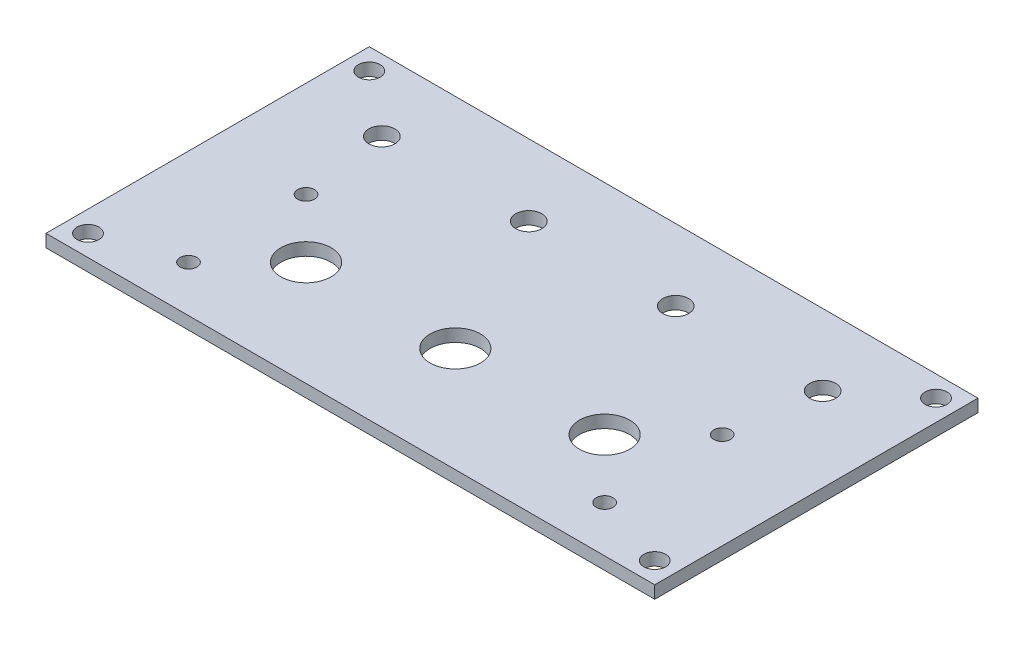
ISO-10303-21;
HEADER;
FILE_DESCRIPTION(('STEP AP214'),'2;1');
FILE_NAME('part.step','',(''),(''),'','','');
FILE_SCHEMA(('AUTOMOTIVE_DESIGN { 1 0 10303 214 1 1 1 1 }'));
ENDSEC;
DATA;
#1=APPLICATION_CONTEXT('core data for automotive mechanical design processes');
#2=APPLICATION_PROTOCOL_DEFINITION('international standard','automotive_design',2000,#1);
#3=PRODUCT_CONTEXT('',#1,'mechanical');
#4=PRODUCT('Part','Part','',(#3));
#5=PRODUCT_RELATED_PRODUCT_CATEGORY('part','',(#4));
#6=PRODUCT_DEFINITION_FORMATION('','',#4);
#7=PRODUCT_DEFINITION_CONTEXT('part definition',#1,'design');
#8=PRODUCT_DEFINITION('design','',#6,#7);
#9=PRODUCT_DEFINITION_SHAPE('','',#8);
#10=(LENGTH_UNIT() NAMED_UNIT(*) SI_UNIT(.MILLI.,.METRE.));
#11=(NAMED_UNIT(*) PLANE_ANGLE_UNIT() SI_UNIT($,.RADIAN.));
#12=(NAMED_UNIT(*) SI_UNIT($,.STERADIAN.) SOLID_ANGLE_UNIT());
#13=UNCERTAINTY_MEASURE_WITH_UNIT(LENGTH_MEASURE(1.E-05),#10,'distance_accuracy_value','');
#14=(GEOMETRIC_REPRESENTATION_CONTEXT(3) GLOBAL_UNCERTAINTY_ASSIGNED_CONTEXT((#13)) GLOBAL_UNIT_ASSIGNED_CONTEXT((#10,
#11,#12)) REPRESENTATION_CONTEXT('',''));
#15=CARTESIAN_POINT('',(0.,0.,0.));
#16=DIRECTION('',(0.,0.,1.));
#17=DIRECTION('',(1.,0.,0.));
#18=AXIS2_PLACEMENT_3D('',#15,#16,#17);
#19=CARTESIAN_POINT('',(0.,3.,0.));
#20=DIRECTION('',(0.,0.,-1.));
#21=DIRECTION('',(-1.,0.,0.));
#22=AXIS2_PLACEMENT_3D('',#19,#20,#21);
#23=PLANE('',#22);
#24=DIRECTION('',(1.,0.,0.));
#25=VECTOR('',#24,1.);
#26=CARTESIAN_POINT('',(0.,0.,0.));
#27=LINE('',#26,#25);
#28=CARTESIAN_POINT('',(0.,0.,0.));
#29=VERTEX_POINT('',#28);
#30=CARTESIAN_POINT('',(145.,0.,0.));
#31=VERTEX_POINT('',#30);
#32=EDGE_CURVE('E145',#29,#31,#27,.T.);
#33=ORIENTED_EDGE('',*,*,#32,.T.);
#34=DIRECTION('',(0.,-1.,0.));
#35=VECTOR('',#34,1.);
#36=CARTESIAN_POINT('',(145.,3.,0.));
#37=LINE('',#36,#35);
#38=CARTESIAN_POINT('',(145.,3.,0.));
#39=VERTEX_POINT('',#38);
#40=EDGE_CURVE('E11',#39,#31,#37,.T.);
#41=ORIENTED_EDGE('',*,*,#40,.F.);
#42=DIRECTION('',(1.,0.,0.));
#43=VECTOR('',#42,1.);
#44=CARTESIAN_POINT('',(0.,3.,0.));
#45=LINE('',#44,#43);
#46=CARTESIAN_POINT('',(0.,3.,0.));
#47=VERTEX_POINT('',#46);
#48=EDGE_CURVE('E86',#47,#39,#45,.T.);
#49=ORIENTED_EDGE('',*,*,#48,.F.);
#50=DIRECTION('',(0.,-1.,0.));
#51=VECTOR('',#50,1.);
#52=CARTESIAN_POINT('',(0.,3.,0.));
#53=LINE('',#52,#51);
#54=EDGE_CURVE('E52',#47,#29,#53,.T.);
#55=ORIENTED_EDGE('',*,*,#54,.T.);
#56=EDGE_LOOP('',(#33,#41,#49,#55));
#57=FACE_BOUND('',#56,.T.);
#58=ADVANCED_FACE('F35',(#57),#23,.F.);
#59=CARTESIAN_POINT('',(145.,3.,0.));
#60=DIRECTION('',(-1.,0.,0.));
#61=DIRECTION('',(0.,0.,1.));
#62=AXIS2_PLACEMENT_3D('',#59,#60,#61);
#63=PLANE('',#62);
#64=DIRECTION('',(0.,0.,-1.));
#65=VECTOR('',#64,1.);
#66=CARTESIAN_POINT('',(145.,0.,0.));
#67=LINE('',#66,#65);
#68=CARTESIAN_POINT('',(145.,0.,-77.));
#69=VERTEX_POINT('',#68);
#70=EDGE_CURVE('E91',#31,#69,#67,.T.);
#71=ORIENTED_EDGE('',*,*,#70,.T.);
#72=DIRECTION('',(0.,-1.,0.));
#73=VECTOR('',#72,1.);
#74=CARTESIAN_POINT('',(145.,3.,-77.));
#75=LINE('',#74,#73);
#76=CARTESIAN_POINT('',(145.,3.,-77.));
#77=VERTEX_POINT('',#76);
#78=EDGE_CURVE('E44',#77,#69,#75,.T.);
#79=ORIENTED_EDGE('',*,*,#78,.F.);
#80=DIRECTION('',(0.,0.,-1.));
#81=VECTOR('',#80,1.);
#82=CARTESIAN_POINT('',(145.,3.,0.));
#83=LINE('',#82,#81);
#84=EDGE_CURVE('E77',#39,#77,#83,.T.);
#85=ORIENTED_EDGE('',*,*,#84,.F.);
#86=ORIENTED_EDGE('',*,*,#40,.T.);
#87=EDGE_LOOP('',(#71,#79,#85,#86));
#88=FACE_BOUND('',#87,.T.);
#89=ADVANCED_FACE('F90',(#88),#63,.F.);
#90=CARTESIAN_POINT('',(0.,3.,-77.));
#91=DIRECTION('',(0.,0.,-1.));
#92=DIRECTION('',(-1.,0.,0.));
#93=AXIS2_PLACEMENT_3D('',#90,#91,#92);
#94=PLANE('',#93);
#95=DIRECTION('',(1.,0.,0.));
#96=VECTOR('',#95,1.);
#97=CARTESIAN_POINT('',(0.,0.,-77.));
#98=LINE('',#97,#96);
#99=CARTESIAN_POINT('',(0.,0.,-77.));
#100=VERTEX_POINT('',#99);
#101=EDGE_CURVE('E148',#100,#69,#98,.T.);
#102=ORIENTED_EDGE('',*,*,#101,.F.);
#103=DIRECTION('',(0.,-1.,0.));
#104=VECTOR('',#103,1.);
#105=CARTESIAN_POINT('',(0.,3.,-77.));
#106=LINE('',#105,#104);
#107=CARTESIAN_POINT('',(0.,3.,-77.));
#108=VERTEX_POINT('',#107);
#109=EDGE_CURVE('E66',#108,#100,#106,.T.);
#110=ORIENTED_EDGE('',*,*,#109,.F.);
#111=DIRECTION('',(1.,0.,0.));
#112=VECTOR('',#111,1.);
#113=CARTESIAN_POINT('',(0.,3.,-77.));
#114=LINE('',#113,#112);
#115=EDGE_CURVE('E85',#108,#77,#114,.T.);
#116=ORIENTED_EDGE('',*,*,#115,.T.);
#117=ORIENTED_EDGE('',*,*,#78,.T.);
#118=EDGE_LOOP('',(#102,#110,#116,#117));
#119=FACE_BOUND('',#118,.T.);
#120=ADVANCED_FACE('F94',(#119),#94,.T.);
#121=CARTESIAN_POINT('',(90.,3.,-60.));
#122=DIRECTION('',(0.,-1.,0.));
#123=DIRECTION('',(0.,0.,-1.));
#124=AXIS2_PLACEMENT_3D('',#121,#122,#123);
#125=CYLINDRICAL_SURFACE('',#124,3.1);
#126=CARTESIAN_POINT('',(90.,3.,-60.));
#127=DIRECTION('',(0.,1.,0.));
#128=DIRECTION('',(0.,0.,1.));
#129=AXIS2_PLACEMENT_3D('',#126,#127,#128);
#130=CIRCLE('',#129,3.1);
#131=CARTESIAN_POINT('',(90.,3.,-56.9));
#132=VERTEX_POINT('',#131);
#133=EDGE_CURVE('E106',#132,#132,#130,.T.);
#134=ORIENTED_EDGE('',*,*,#133,.T.);
#135=EDGE_LOOP('',(#134));
#136=FACE_BOUND('',#135,.T.);
#137=CARTESIAN_POINT('',(90.,0.,-60.));
#138=DIRECTION('',(0.,1.,0.));
#139=DIRECTION('',(0.,0.,1.));
#140=AXIS2_PLACEMENT_3D('',#137,#138,#139);
#141=CIRCLE('',#140,3.1);
#142=CARTESIAN_POINT('',(90.,0.,-56.9));
#143=VERTEX_POINT('',#142);
#144=EDGE_CURVE('E159',#143,#143,#141,.T.);
#145=ORIENTED_EDGE('',*,*,#144,.F.);
#146=EDGE_LOOP('',(#145));
#147=FACE_BOUND('',#146,.T.);
#148=ADVANCED_FACE('F300',(#136,#147),#125,.F.);
#149=CARTESIAN_POINT('',(55.,3.,-60.));
#150=DIRECTION('',(0.,-1.,0.));
#151=DIRECTION('',(0.,0.,-1.));
#152=AXIS2_PLACEMENT_3D('',#149,#150,#151);
#153=CYLINDRICAL_SURFACE('',#152,3.1);
#154=CARTESIAN_POINT('',(55.,3.,-60.));
#155=DIRECTION('',(0.,1.,0.));
#156=DIRECTION('',(0.,0.,1.));
#157=AXIS2_PLACEMENT_3D('',#154,#155,#156);
#158=CIRCLE('',#157,3.1);
#159=CARTESIAN_POINT('',(55.,3.,-56.9));
#160=VERTEX_POINT('',#159);
#161=EDGE_CURVE('E103',#160,#160,#158,.T.);
#162=ORIENTED_EDGE('',*,*,#161,.T.);
#163=EDGE_LOOP('',(#162));
#164=FACE_BOUND('',#163,.T.);
#165=CARTESIAN_POINT('',(55.,0.,-60.));
#166=DIRECTION('',(0.,1.,0.));
#167=DIRECTION('',(0.,0.,1.));
#168=AXIS2_PLACEMENT_3D('',#165,#166,#167);
#169=CIRCLE('',#168,3.1);
#170=CARTESIAN_POINT('',(55.,0.,-56.9));
#171=VERTEX_POINT('',#170);
#172=EDGE_CURVE('E156',#171,#171,#169,.T.);
#173=ORIENTED_EDGE('',*,*,#172,.F.);
#174=EDGE_LOOP('',(#173));
#175=FACE_BOUND('',#174,.T.);
#176=ADVANCED_FACE('F302',(#164,#175),#153,.F.);
#177=CARTESIAN_POINT('',(20.,3.,-60.));
#178=DIRECTION('',(0.,-1.,0.));
#179=DIRECTION('',(0.,0.,-1.));
#180=AXIS2_PLACEMENT_3D('',#177,#178,#179);
#181=CYLINDRICAL_SURFACE('',#180,3.1);
#182=CARTESIAN_POINT('',(20.,3.,-60.));
#183=DIRECTION('',(0.,1.,0.));
#184=DIRECTION('',(0.,0.,1.));
#185=AXIS2_PLACEMENT_3D('',#182,#183,#184);
#186=CIRCLE('',#185,3.1);
#187=CARTESIAN_POINT('',(20.,3.,-56.9));
#188=VERTEX_POINT('',#187);
#189=EDGE_CURVE('E97',#188,#188,#186,.T.);
#190=ORIENTED_EDGE('',*,*,#189,.T.);
#191=EDGE_LOOP('',(#190));
#192=FACE_BOUND('',#191,.T.);
#193=CARTESIAN_POINT('',(20.,0.,-60.));
#194=DIRECTION('',(0.,1.,0.));
#195=DIRECTION('',(0.,0.,1.));
#196=AXIS2_PLACEMENT_3D('',#193,#194,#195);
#197=CIRCLE('',#196,3.1);
#198=CARTESIAN_POINT('',(20.,0.,-56.9));
#199=VERTEX_POINT('',#198);
#200=EDGE_CURVE('E153',#199,#199,#197,.T.);
#201=ORIENTED_EDGE('',*,*,#200,.F.);
#202=EDGE_LOOP('',(#201));
#203=FACE_BOUND('',#202,.T.);
#204=ADVANCED_FACE('F309',(#192,#203),#181,.F.);
#205=CARTESIAN_POINT('',(0.,3.,0.));
#206=DIRECTION('',(-1.,0.,0.));
#207=DIRECTION('',(0.,0.,1.));
#208=AXIS2_PLACEMENT_3D('',#205,#206,#207);
#209=PLANE('',#208);
#210=DIRECTION('',(0.,0.,-1.));
#211=VECTOR('',#210,1.);
#212=CARTESIAN_POINT('',(0.,0.,0.));
#213=LINE('',#212,#211);
#214=EDGE_CURVE('E150',#29,#100,#213,.T.);
#215=ORIENTED_EDGE('',*,*,#214,.F.);
#216=ORIENTED_EDGE('',*,*,#54,.F.);
#217=DIRECTION('',(0.,0.,-1.));
#218=VECTOR('',#217,1.);
#219=CARTESIAN_POINT('',(0.,3.,0.));
#220=LINE('',#219,#218);
#221=EDGE_CURVE('E95',#47,#108,#220,.T.);
#222=ORIENTED_EDGE('',*,*,#221,.T.);
#223=ORIENTED_EDGE('',*,*,#109,.T.);
#224=EDGE_LOOP('',(#215,#216,#222,#223));
#225=FACE_BOUND('',#224,.T.);
#226=ADVANCED_FACE('F233',(#225),#209,.T.);
#227=CARTESIAN_POINT('',(5.,3.,-72.));
#228=DIRECTION('',(0.,-1.,0.));
#229=DIRECTION('',(0.,0.,-1.));
#230=AXIS2_PLACEMENT_3D('',#227,#228,#229);
#231=CYLINDRICAL_SURFACE('',#230,2.6);
#232=CARTESIAN_POINT('',(5.,3.,-72.));
#233=DIRECTION('',(0.,1.,0.));
#234=DIRECTION('',(0.,0.,1.));
#235=AXIS2_PLACEMENT_3D('',#232,#233,#234);
#236=CIRCLE('',#235,2.6);
#237=CARTESIAN_POINT('',(5.,3.,-69.4));
#238=VERTEX_POINT('',#237);
#239=EDGE_CURVE('E201',#238,#238,#236,.T.);
#240=ORIENTED_EDGE('',*,*,#239,.T.);
#241=EDGE_LOOP('',(#240));
#242=FACE_BOUND('',#241,.T.);
#243=CARTESIAN_POINT('',(5.,0.,-72.));
#244=DIRECTION('',(0.,1.,0.));
#245=DIRECTION('',(0.,0.,1.));
#246=AXIS2_PLACEMENT_3D('',#243,#244,#245);
#247=CIRCLE('',#246,2.6);
#248=CARTESIAN_POINT('',(5.,0.,-69.4));
#249=VERTEX_POINT('',#248);
#250=EDGE_CURVE('E142',#249,#249,#247,.T.);
#251=ORIENTED_EDGE('',*,*,#250,.F.);
#252=EDGE_LOOP('',(#251));
#253=FACE_BOUND('',#252,.T.);
#254=ADVANCED_FACE('F205',(#242,#253),#231,.F.);
#255=CARTESIAN_POINT('',(5.,3.,-5.));
#256=DIRECTION('',(0.,-1.,0.));
#257=DIRECTION('',(0.,0.,-1.));
#258=AXIS2_PLACEMENT_3D('',#255,#256,#257);
#259=CYLINDRICAL_SURFACE('',#258,2.6);
#260=CARTESIAN_POINT('',(5.,3.,-5.));
#261=DIRECTION('',(0.,1.,0.));
#262=DIRECTION('',(0.,0.,1.));
#263=AXIS2_PLACEMENT_3D('',#260,#261,#262);
#264=CIRCLE('',#263,2.6);
#265=CARTESIAN_POINT('',(5.,3.,-2.4));
#266=VERTEX_POINT('',#265);
#267=EDGE_CURVE('E198',#266,#266,#264,.T.);
#268=ORIENTED_EDGE('',*,*,#267,.T.);
#269=EDGE_LOOP('',(#268));
#270=FACE_BOUND('',#269,.T.);
#271=CARTESIAN_POINT('',(5.,0.,-5.));
#272=DIRECTION('',(0.,1.,0.));
#273=DIRECTION('',(0.,0.,1.));
#274=AXIS2_PLACEMENT_3D('',#271,#272,#273);
#275=CIRCLE('',#274,2.6);
#276=CARTESIAN_POINT('',(5.,0.,-2.4));
#277=VERTEX_POINT('',#276);
#278=EDGE_CURVE('E139',#277,#277,#275,.T.);
#279=ORIENTED_EDGE('',*,*,#278,.F.);
#280=EDGE_LOOP('',(#279));
#281=FACE_BOUND('',#280,.T.);
#282=ADVANCED_FACE('F232',(#270,#281),#259,.F.);
#283=CARTESIAN_POINT('',(140.,3.,-5.));
#284=DIRECTION('',(0.,-1.,0.));
#285=DIRECTION('',(0.,0.,-1.));
#286=AXIS2_PLACEMENT_3D('',#283,#284,#285);
#287=CYLINDRICAL_SURFACE('',#286,2.59999999999999);
#288=CARTESIAN_POINT('',(140.,3.,-5.));
#289=DIRECTION('',(0.,1.,0.));
#290=DIRECTION('',(0.,0.,1.));
#291=AXIS2_PLACEMENT_3D('',#288,#289,#290);
#292=CIRCLE('',#291,2.59999999999999);
#293=CARTESIAN_POINT('',(140.,3.,-2.40000000000001));
#294=VERTEX_POINT('',#293);
#295=EDGE_CURVE('E195',#294,#294,#292,.T.);
#296=ORIENTED_EDGE('',*,*,#295,.T.);
#297=EDGE_LOOP('',(#296));
#298=FACE_BOUND('',#297,.T.);
#299=CARTESIAN_POINT('',(140.,0.,-5.));
#300=DIRECTION('',(0.,1.,0.));
#301=DIRECTION('',(0.,0.,1.));
#302=AXIS2_PLACEMENT_3D('',#299,#300,#301);
#303=CIRCLE('',#302,2.59999999999999);
#304=CARTESIAN_POINT('',(140.,0.,-2.40000000000001));
#305=VERTEX_POINT('',#304);
#306=EDGE_CURVE('E136',#305,#305,#303,.T.);
#307=ORIENTED_EDGE('',*,*,#306,.F.);
#308=EDGE_LOOP('',(#307));
#309=FACE_BOUND('',#308,.T.);
#310=ADVANCED_FACE('F236',(#298,#309),#287,.F.);
#311=CARTESIAN_POINT('',(140.,3.,-72.));
#312=DIRECTION('',(0.,-1.,0.));
#313=DIRECTION('',(0.,0.,-1.));
#314=AXIS2_PLACEMENT_3D('',#311,#312,#313);
#315=CYLINDRICAL_SURFACE('',#314,2.59999999999999);
#316=CARTESIAN_POINT('',(140.,3.,-72.));
#317=DIRECTION('',(0.,1.,0.));
#318=DIRECTION('',(0.,0.,1.));
#319=AXIS2_PLACEMENT_3D('',#316,#317,#318);
#320=CIRCLE('',#319,2.59999999999999);
#321=CARTESIAN_POINT('',(140.,3.,-69.4));
#322=VERTEX_POINT('',#321);
#323=EDGE_CURVE('E192',#322,#322,#320,.T.);
#324=ORIENTED_EDGE('',*,*,#323,.T.);
#325=EDGE_LOOP('',(#324));
#326=FACE_BOUND('',#325,.T.);
#327=CARTESIAN_POINT('',(140.,0.,-72.));
#328=DIRECTION('',(0.,1.,0.));
#329=DIRECTION('',(0.,0.,1.));
#330=AXIS2_PLACEMENT_3D('',#327,#328,#329);
#331=CIRCLE('',#330,2.59999999999999);
#332=CARTESIAN_POINT('',(140.,0.,-69.4));
#333=VERTEX_POINT('',#332);
#334=EDGE_CURVE('E133',#333,#333,#331,.T.);
#335=ORIENTED_EDGE('',*,*,#334,.F.);
#336=EDGE_LOOP('',(#335));
#337=FACE_BOUND('',#336,.T.);
#338=ADVANCED_FACE('F240',(#326,#337),#315,.F.);
#339=CARTESIAN_POINT('',(36.94,3.,-25.));
#340=DIRECTION('',(0.,-1.,0.));
#341=DIRECTION('',(0.,0.,-1.));
#342=AXIS2_PLACEMENT_3D('',#339,#340,#341);
#343=CYLINDRICAL_SURFACE('',#342,6.);
#344=CARTESIAN_POINT('',(36.94,3.,-25.));
#345=DIRECTION('',(0.,1.,0.));
#346=DIRECTION('',(0.,0.,1.));
#347=AXIS2_PLACEMENT_3D('',#344,#345,#346);
#348=CIRCLE('',#347,6.);
#349=CARTESIAN_POINT('',(36.94,3.,-19.));
#350=VERTEX_POINT('',#349);
#351=EDGE_CURVE('E189',#350,#350,#348,.T.);
#352=ORIENTED_EDGE('',*,*,#351,.T.);
#353=EDGE_LOOP('',(#352));
#354=FACE_BOUND('',#353,.T.);
#355=CARTESIAN_POINT('',(36.94,0.,-25.));
#356=DIRECTION('',(0.,1.,0.));
#357=DIRECTION('',(0.,0.,1.));
#358=AXIS2_PLACEMENT_3D('',#355,#356,#357);
#359=CIRCLE('',#358,6.);
#360=CARTESIAN_POINT('',(36.94,0.,-19.));
#361=VERTEX_POINT('',#360);
#362=EDGE_CURVE('E130',#361,#361,#359,.T.);
#363=ORIENTED_EDGE('',*,*,#362,.F.);
#364=EDGE_LOOP('',(#363));
#365=FACE_BOUND('',#364,.T.);
#366=ADVANCED_FACE('F244',(#354,#365),#343,.F.);
#367=CARTESIAN_POINT('',(72.5,3.,-25.));
#368=DIRECTION('',(0.,-1.,0.));
#369=DIRECTION('',(0.,0.,-1.));
#370=AXIS2_PLACEMENT_3D('',#367,#368,#369);
#371=CYLINDRICAL_SURFACE('',#370,6.);
#372=CARTESIAN_POINT('',(72.5,3.,-25.));
#373=DIRECTION('',(0.,1.,0.));
#374=DIRECTION('',(0.,0.,1.));
#375=AXIS2_PLACEMENT_3D('',#372,#373,#374);
#376=CIRCLE('',#375,6.);
#377=CARTESIAN_POINT('',(72.5,3.,-19.));
#378=VERTEX_POINT('',#377);
#379=EDGE_CURVE('E186',#378,#378,#376,.T.);
#380=ORIENTED_EDGE('',*,*,#379,.T.);
#381=EDGE_LOOP('',(#380));
#382=FACE_BOUND('',#381,.T.);
#383=CARTESIAN_POINT('',(72.5,0.,-25.));
#384=DIRECTION('',(0.,1.,0.));
#385=DIRECTION('',(0.,0.,1.));
#386=AXIS2_PLACEMENT_3D('',#383,#384,#385);
#387=CIRCLE('',#386,6.);
#388=CARTESIAN_POINT('',(72.5,0.,-19.));
#389=VERTEX_POINT('',#388);
#390=EDGE_CURVE('E127',#389,#389,#387,.T.);
#391=ORIENTED_EDGE('',*,*,#390,.F.);
#392=EDGE_LOOP('',(#391));
#393=FACE_BOUND('',#392,.T.);
#394=ADVANCED_FACE('F248',(#382,#393),#371,.F.);
#395=CARTESIAN_POINT('',(108.06,3.,-25.));
#396=DIRECTION('',(0.,-1.,0.));
#397=DIRECTION('',(0.,0.,-1.));
#398=AXIS2_PLACEMENT_3D('',#395,#396,#397);
#399=CYLINDRICAL_SURFACE('',#398,6.00000000000002);
#400=CARTESIAN_POINT('',(108.06,3.,-25.));
#401=DIRECTION('',(0.,1.,0.));
#402=DIRECTION('',(0.,0.,1.));
#403=AXIS2_PLACEMENT_3D('',#400,#401,#402);
#404=CIRCLE('',#403,6.00000000000002);
#405=CARTESIAN_POINT('',(108.06,3.,-19.));
#406=VERTEX_POINT('',#405);
#407=EDGE_CURVE('E183',#406,#406,#404,.T.);
#408=ORIENTED_EDGE('',*,*,#407,.T.);
#409=EDGE_LOOP('',(#408));
#410=FACE_BOUND('',#409,.T.);
#411=CARTESIAN_POINT('',(108.06,0.,-25.));
#412=DIRECTION('',(0.,1.,0.));
#413=DIRECTION('',(0.,0.,1.));
#414=AXIS2_PLACEMENT_3D('',#411,#412,#413);
#415=CIRCLE('',#414,6.00000000000002);
#416=CARTESIAN_POINT('',(108.06,0.,-19.));
#417=VERTEX_POINT('',#416);
#418=EDGE_CURVE('E124',#417,#417,#415,.T.);
#419=ORIENTED_EDGE('',*,*,#418,.F.);
#420=EDGE_LOOP('',(#419));
#421=FACE_BOUND('',#420,.T.);
#422=ADVANCED_FACE('F252',(#410,#421),#399,.F.);
#423=CARTESIAN_POINT('',(22.94,3.,-39.));
#424=DIRECTION('',(0.,-1.,0.));
#425=DIRECTION('',(0.,0.,-1.));
#426=AXIS2_PLACEMENT_3D('',#423,#424,#425);
#427=CYLINDRICAL_SURFACE('',#426,2.);
#428=CARTESIAN_POINT('',(22.94,3.,-39.));
#429=DIRECTION('',(0.,1.,0.));
#430=DIRECTION('',(0.,0.,1.));
#431=AXIS2_PLACEMENT_3D('',#428,#429,#430);
#432=CIRCLE('',#431,2.);
#433=CARTESIAN_POINT('',(22.94,3.,-37.));
#434=VERTEX_POINT('',#433);
#435=EDGE_CURVE('E180',#434,#434,#432,.T.);
#436=ORIENTED_EDGE('',*,*,#435,.T.);
#437=EDGE_LOOP('',(#436));
#438=FACE_BOUND('',#437,.T.);
#439=CARTESIAN_POINT('',(22.94,0.,-39.));
#440=DIRECTION('',(0.,1.,0.));
#441=DIRECTION('',(0.,0.,1.));
#442=AXIS2_PLACEMENT_3D('',#439,#440,#441);
#443=CIRCLE('',#442,2.);
#444=CARTESIAN_POINT('',(22.94,0.,-37.));
#445=VERTEX_POINT('',#444);
#446=EDGE_CURVE('E121',#445,#445,#443,.T.);
#447=ORIENTED_EDGE('',*,*,#446,.F.);
#448=EDGE_LOOP('',(#447));
#449=FACE_BOUND('',#448,.T.);
#450=ADVANCED_FACE('F256',(#438,#449),#427,.F.);
#451=CARTESIAN_POINT('',(122.06,3.,-39.));
#452=DIRECTION('',(0.,-1.,0.));
#453=DIRECTION('',(0.,0.,-1.));
#454=AXIS2_PLACEMENT_3D('',#451,#452,#453);
#455=CYLINDRICAL_SURFACE('',#454,2.);
#456=CARTESIAN_POINT('',(122.06,3.,-39.));
#457=DIRECTION('',(0.,1.,0.));
#458=DIRECTION('',(0.,0.,1.));
#459=AXIS2_PLACEMENT_3D('',#456,#457,#458);
#460=CIRCLE('',#459,2.);
#461=CARTESIAN_POINT('',(122.06,3.,-37.));
#462=VERTEX_POINT('',#461);
#463=EDGE_CURVE('E175',#462,#462,#460,.T.);
#464=ORIENTED_EDGE('',*,*,#463,.T.);
#465=EDGE_LOOP('',(#464));
#466=FACE_BOUND('',#465,.T.);
#467=CARTESIAN_POINT('',(122.06,0.,-39.));
#468=DIRECTION('',(0.,1.,0.));
#469=DIRECTION('',(0.,0.,1.));
#470=AXIS2_PLACEMENT_3D('',#467,#468,#469);
#471=CIRCLE('',#470,2.);
#472=CARTESIAN_POINT('',(122.06,0.,-37.));
#473=VERTEX_POINT('',#472);
#474=EDGE_CURVE('E118',#473,#473,#471,.T.);
#475=ORIENTED_EDGE('',*,*,#474,.F.);
#476=EDGE_LOOP('',(#475));
#477=FACE_BOUND('',#476,.T.);
#478=ADVANCED_FACE('F260',(#466,#477),#455,.F.);
#479=CARTESIAN_POINT('',(122.06,3.,-11.));
#480=DIRECTION('',(0.,-1.,0.));
#481=DIRECTION('',(0.,0.,-1.));
#482=AXIS2_PLACEMENT_3D('',#479,#480,#481);
#483=CYLINDRICAL_SURFACE('',#482,2.);
#484=CARTESIAN_POINT('',(122.06,3.,-11.));
#485=DIRECTION('',(0.,1.,0.));
#486=DIRECTION('',(0.,0.,1.));
#487=AXIS2_PLACEMENT_3D('',#484,#485,#486);
#488=CIRCLE('',#487,2.);
#489=CARTESIAN_POINT('',(122.06,3.,-9.00000000000001));
#490=VERTEX_POINT('',#489);
#491=EDGE_CURVE('E170',#490,#490,#488,.T.);
#492=ORIENTED_EDGE('',*,*,#491,.T.);
#493=EDGE_LOOP('',(#492));
#494=FACE_BOUND('',#493,.T.);
#495=CARTESIAN_POINT('',(122.06,0.,-11.));
#496=DIRECTION('',(0.,1.,0.));
#497=DIRECTION('',(0.,0.,1.));
#498=AXIS2_PLACEMENT_3D('',#495,#496,#497);
#499=CIRCLE('',#498,2.);
#500=CARTESIAN_POINT('',(122.06,0.,-9.00000000000001));
#501=VERTEX_POINT('',#500);
#502=EDGE_CURVE('E115',#501,#501,#499,.T.);
#503=ORIENTED_EDGE('',*,*,#502,.F.);
#504=EDGE_LOOP('',(#503));
#505=FACE_BOUND('',#504,.T.);
#506=ADVANCED_FACE('F263',(#494,#505),#483,.F.);
#507=CARTESIAN_POINT('',(22.94,3.,-11.));
#508=DIRECTION('',(0.,-1.,0.));
#509=DIRECTION('',(0.,0.,-1.));
#510=AXIS2_PLACEMENT_3D('',#507,#508,#509);
#511=CYLINDRICAL_SURFACE('',#510,2.);
#512=CARTESIAN_POINT('',(22.94,3.,-11.));
#513=DIRECTION('',(0.,1.,0.));
#514=DIRECTION('',(0.,0.,1.));
#515=AXIS2_PLACEMENT_3D('',#512,#513,#514);
#516=CIRCLE('',#515,2.);
#517=CARTESIAN_POINT('',(22.94,3.,-9.));
#518=VERTEX_POINT('',#517);
#519=EDGE_CURVE('E165',#518,#518,#516,.T.);
#520=ORIENTED_EDGE('',*,*,#519,.T.);
#521=EDGE_LOOP('',(#520));
#522=FACE_BOUND('',#521,.T.);
#523=CARTESIAN_POINT('',(22.94,0.,-11.));
#524=DIRECTION('',(0.,1.,0.));
#525=DIRECTION('',(0.,0.,1.));
#526=AXIS2_PLACEMENT_3D('',#523,#524,#525);
#527=CIRCLE('',#526,2.);
#528=CARTESIAN_POINT('',(22.94,0.,-9.));
#529=VERTEX_POINT('',#528);
#530=EDGE_CURVE('E112',#529,#529,#527,.T.);
#531=ORIENTED_EDGE('',*,*,#530,.F.);
#532=EDGE_LOOP('',(#531));
#533=FACE_BOUND('',#532,.T.);
#534=ADVANCED_FACE('F37',(#522,#533),#511,.F.);
#535=CARTESIAN_POINT('',(125.,3.,-60.));
#536=DIRECTION('',(0.,-1.,0.));
#537=DIRECTION('',(0.,0.,-1.));
#538=AXIS2_PLACEMENT_3D('',#535,#536,#537);
#539=CYLINDRICAL_SURFACE('',#538,3.09999999999996);
#540=CARTESIAN_POINT('',(125.,3.,-60.));
#541=DIRECTION('',(0.,1.,0.));
#542=DIRECTION('',(0.,0.,1.));
#543=AXIS2_PLACEMENT_3D('',#540,#541,#542);
#544=CIRCLE('',#543,3.09999999999996);
#545=CARTESIAN_POINT('',(125.,3.,-56.9));
#546=VERTEX_POINT('',#545);
#547=EDGE_CURVE('E109',#546,#546,#544,.T.);
#548=ORIENTED_EDGE('',*,*,#547,.T.);
#549=EDGE_LOOP('',(#548));
#550=FACE_BOUND('',#549,.T.);
#551=CARTESIAN_POINT('',(125.,0.,-60.));
#552=DIRECTION('',(0.,1.,0.));
#553=DIRECTION('',(0.,0.,1.));
#554=AXIS2_PLACEMENT_3D('',#551,#552,#553);
#555=CIRCLE('',#554,3.09999999999996);
#556=CARTESIAN_POINT('',(125.,0.,-56.9));
#557=VERTEX_POINT('',#556);
#558=EDGE_CURVE('E162',#557,#557,#555,.T.);
#559=ORIENTED_EDGE('',*,*,#558,.F.);
#560=EDGE_LOOP('',(#559));
#561=FACE_BOUND('',#560,.T.);
#562=ADVANCED_FACE('F210',(#550,#561),#539,.F.);
#563=CARTESIAN_POINT('',(0.,3.,0.));
#564=DIRECTION('',(0.,1.,0.));
#565=DIRECTION('',(0.,0.,1.));
#566=AXIS2_PLACEMENT_3D('',#563,#564,#565);
#567=PLANE('',#566);
#568=ORIENTED_EDGE('',*,*,#519,.F.);
#569=EDGE_LOOP('',(#568));
#570=FACE_BOUND('',#569,.T.);
#571=ORIENTED_EDGE('',*,*,#491,.F.);
#572=EDGE_LOOP('',(#571));
#573=FACE_BOUND('',#572,.T.);
#574=ORIENTED_EDGE('',*,*,#463,.F.);
#575=EDGE_LOOP('',(#574));
#576=FACE_BOUND('',#575,.T.);
#577=ORIENTED_EDGE('',*,*,#435,.F.);
#578=EDGE_LOOP('',(#577));
#579=FACE_BOUND('',#578,.T.);
#580=ORIENTED_EDGE('',*,*,#407,.F.);
#581=EDGE_LOOP('',(#580));
#582=FACE_BOUND('',#581,.T.);
#583=ORIENTED_EDGE('',*,*,#379,.F.);
#584=EDGE_LOOP('',(#583));
#585=FACE_BOUND('',#584,.T.);
#586=ORIENTED_EDGE('',*,*,#351,.F.);
#587=EDGE_LOOP('',(#586));
#588=FACE_BOUND('',#587,.T.);
#589=ORIENTED_EDGE('',*,*,#323,.F.);
#590=EDGE_LOOP('',(#589));
#591=FACE_BOUND('',#590,.T.);
#592=ORIENTED_EDGE('',*,*,#295,.F.);
#593=EDGE_LOOP('',(#592));
#594=FACE_BOUND('',#593,.T.);
#595=ORIENTED_EDGE('',*,*,#267,.F.);
#596=EDGE_LOOP('',(#595));
#597=FACE_BOUND('',#596,.T.);
#598=ORIENTED_EDGE('',*,*,#239,.F.);
#599=EDGE_LOOP('',(#598));
#600=FACE_BOUND('',#599,.T.);
#601=ORIENTED_EDGE('',*,*,#48,.T.);
#602=ORIENTED_EDGE('',*,*,#84,.T.);
#603=ORIENTED_EDGE('',*,*,#115,.F.);
#604=ORIENTED_EDGE('',*,*,#221,.F.);
#605=EDGE_LOOP('',(#601,#602,#603,#604));
#606=FACE_BOUND('',#605,.T.);
#607=ORIENTED_EDGE('',*,*,#189,.F.);
#608=EDGE_LOOP('',(#607));
#609=FACE_BOUND('',#608,.T.);
#610=ORIENTED_EDGE('',*,*,#161,.F.);
#611=EDGE_LOOP('',(#610));
#612=FACE_BOUND('',#611,.T.);
#613=ORIENTED_EDGE('',*,*,#133,.F.);
#614=EDGE_LOOP('',(#613));
#615=FACE_BOUND('',#614,.T.);
#616=ORIENTED_EDGE('',*,*,#547,.F.);
#617=EDGE_LOOP('',(#616));
#618=FACE_BOUND('',#617,.T.);
#619=ADVANCED_FACE('F81',(#570,#573,#576,#579,#582,#585,#588,#591,#594,#597,#600,#606,#609,#612,
#615,#618),#567,.T.);
#620=CARTESIAN_POINT('',(0.,0.,0.));
#621=DIRECTION('',(0.,1.,0.));
#622=DIRECTION('',(0.,0.,1.));
#623=AXIS2_PLACEMENT_3D('',#620,#621,#622);
#624=PLANE('',#623);
#625=ORIENTED_EDGE('',*,*,#530,.T.);
#626=EDGE_LOOP('',(#625));
#627=FACE_BOUND('',#626,.T.);
#628=ORIENTED_EDGE('',*,*,#502,.T.);
#629=EDGE_LOOP('',(#628));
#630=FACE_BOUND('',#629,.T.);
#631=ORIENTED_EDGE('',*,*,#474,.T.);
#632=EDGE_LOOP('',(#631));
#633=FACE_BOUND('',#632,.T.);
#634=ORIENTED_EDGE('',*,*,#446,.T.);
#635=EDGE_LOOP('',(#634));
#636=FACE_BOUND('',#635,.T.);
#637=ORIENTED_EDGE('',*,*,#418,.T.);
#638=EDGE_LOOP('',(#637));
#639=FACE_BOUND('',#638,.T.);
#640=ORIENTED_EDGE('',*,*,#390,.T.);
#641=EDGE_LOOP('',(#640));
#642=FACE_BOUND('',#641,.T.);
#643=ORIENTED_EDGE('',*,*,#362,.T.);
#644=EDGE_LOOP('',(#643));
#645=FACE_BOUND('',#644,.T.);
#646=ORIENTED_EDGE('',*,*,#334,.T.);
#647=EDGE_LOOP('',(#646));
#648=FACE_BOUND('',#647,.T.);
#649=ORIENTED_EDGE('',*,*,#306,.T.);
#650=EDGE_LOOP('',(#649));
#651=FACE_BOUND('',#650,.T.);
#652=ORIENTED_EDGE('',*,*,#278,.T.);
#653=EDGE_LOOP('',(#652));
#654=FACE_BOUND('',#653,.T.);
#655=ORIENTED_EDGE('',*,*,#250,.T.);
#656=EDGE_LOOP('',(#655));
#657=FACE_BOUND('',#656,.T.);
#658=ORIENTED_EDGE('',*,*,#32,.F.);
#659=ORIENTED_EDGE('',*,*,#214,.T.);
#660=ORIENTED_EDGE('',*,*,#101,.T.);
#661=ORIENTED_EDGE('',*,*,#70,.F.);
#662=EDGE_LOOP('',(#658,#659,#660,#661));
#663=FACE_BOUND('',#662,.T.);
#664=ORIENTED_EDGE('',*,*,#200,.T.);
#665=EDGE_LOOP('',(#664));
#666=FACE_BOUND('',#665,.T.);
#667=ORIENTED_EDGE('',*,*,#172,.T.);
#668=EDGE_LOOP('',(#667));
#669=FACE_BOUND('',#668,.T.);
#670=ORIENTED_EDGE('',*,*,#144,.T.);
#671=EDGE_LOOP('',(#670));
#672=FACE_BOUND('',#671,.T.);
#673=ORIENTED_EDGE('',*,*,#558,.T.);
#674=EDGE_LOOP('',(#673));
#675=FACE_BOUND('',#674,.T.);
#676=ADVANCED_FACE('F209',(#627,#630,#633,#636,#639,#642,#645,#648,#651,#654,#657,#663,#666,
#669,#672,#675),#624,.F.);
#677=CLOSED_SHELL('',(#58,#89,#120,#148,#176,#204,#226,#254,#282,#310,#338,#366,#394,#422,#450,
#478,#506,#534,#562,#619,#676));
#678=MANIFOLD_SOLID_BREP('B2',#677);
#679=ADVANCED_BREP_SHAPE_REPRESENTATION('',(#18,#678),#14);
#680=SHAPE_DEFINITION_REPRESENTATION(#9,#679);
ENDSEC;
END-ISO-10303-21;
